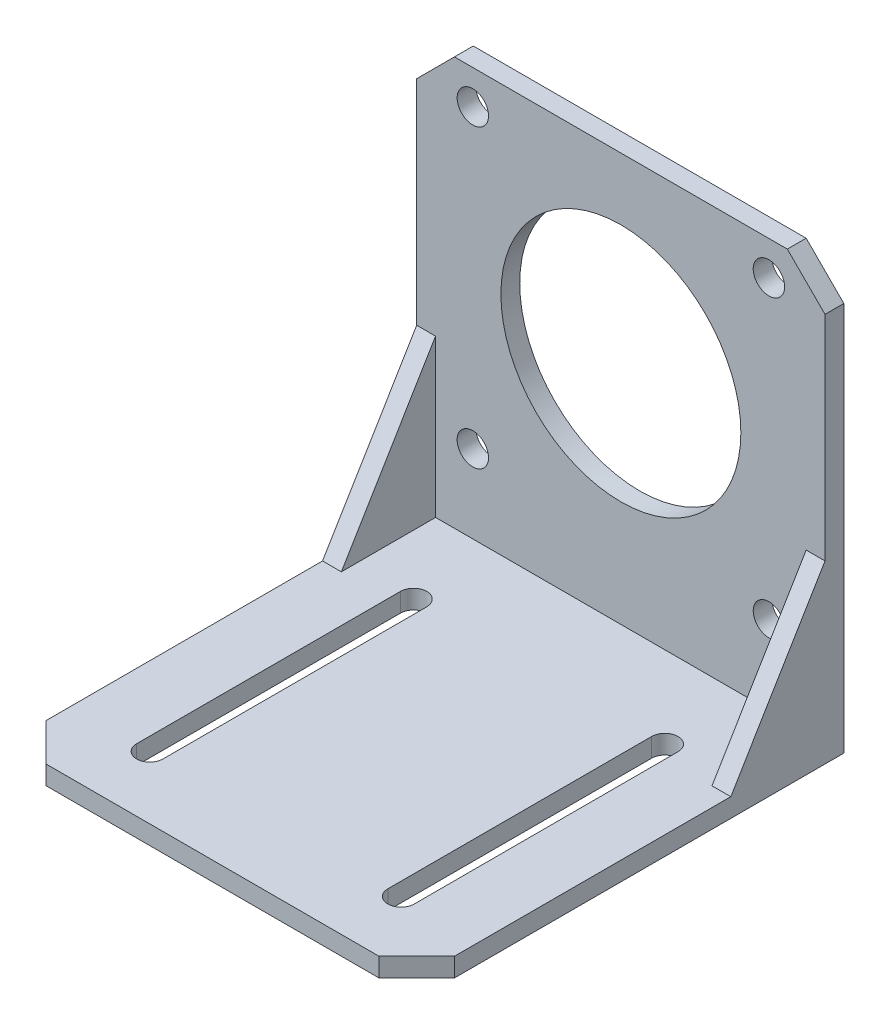
ISO-10303-21;
HEADER;
FILE_DESCRIPTION(('STEP AP214'),'2;1');
FILE_NAME('part.step','',(''),(''),'','','');
FILE_SCHEMA(('AUTOMOTIVE_DESIGN { 1 0 10303 214 1 1 1 1 }'));
ENDSEC;
DATA;
#1=APPLICATION_CONTEXT('core data for automotive mechanical design processes');
#2=APPLICATION_PROTOCOL_DEFINITION('international standard','automotive_design',2000,#1);
#3=PRODUCT_CONTEXT('',#1,'mechanical');
#4=PRODUCT('Part','Part','',(#3));
#5=PRODUCT_RELATED_PRODUCT_CATEGORY('part','',(#4));
#6=PRODUCT_DEFINITION_FORMATION('','',#4);
#7=PRODUCT_DEFINITION_CONTEXT('part definition',#1,'design');
#8=PRODUCT_DEFINITION('design','',#6,#7);
#9=PRODUCT_DEFINITION_SHAPE('','',#8);
#10=(LENGTH_UNIT() NAMED_UNIT(*) SI_UNIT(.MILLI.,.METRE.));
#11=(NAMED_UNIT(*) PLANE_ANGLE_UNIT() SI_UNIT($,.RADIAN.));
#12=(NAMED_UNIT(*) SI_UNIT($,.STERADIAN.) SOLID_ANGLE_UNIT());
#13=UNCERTAINTY_MEASURE_WITH_UNIT(LENGTH_MEASURE(1.E-05),#10,'distance_accuracy_value','');
#14=(GEOMETRIC_REPRESENTATION_CONTEXT(3) GLOBAL_UNCERTAINTY_ASSIGNED_CONTEXT((#13)) GLOBAL_UNIT_ASSIGNED_CONTEXT((#10,
#11,#12)) REPRESENTATION_CONTEXT('',''));
#15=CARTESIAN_POINT('',(0.,0.,0.));
#16=DIRECTION('',(0.,0.,1.));
#17=DIRECTION('',(1.,0.,0.));
#18=AXIS2_PLACEMENT_3D('',#15,#16,#17);
#19=CARTESIAN_POINT('',(0.,68.,0.));
#20=DIRECTION('',(0.,1.,0.));
#21=DIRECTION('',(0.,0.,1.));
#22=AXIS2_PLACEMENT_3D('',#19,#20,#21);
#23=PLANE('',#22);
#24=DIRECTION('',(0.,0.,1.));
#25=VECTOR('',#24,1.);
#26=CARTESIAN_POINT('',(6.,68.,-65.001));
#27=LINE('',#26,#25);
#28=CARTESIAN_POINT('',(6.,68.,-68.));
#29=VERTEX_POINT('',#28);
#30=CARTESIAN_POINT('',(6.,68.,-65.));
#31=VERTEX_POINT('',#30);
#32=EDGE_CURVE('E296',#29,#31,#27,.T.);
#33=ORIENTED_EDGE('',*,*,#32,.T.);
#34=DIRECTION('',(1.,0.,0.));
#35=VECTOR('',#34,1.);
#36=CARTESIAN_POINT('',(0.,68.,-65.));
#37=LINE('',#36,#35);
#38=CARTESIAN_POINT('',(59.,68.,-65.));
#39=VERTEX_POINT('',#38);
#40=EDGE_CURVE('E258',#31,#39,#37,.T.);
#41=ORIENTED_EDGE('',*,*,#40,.T.);
#42=DIRECTION('',(0.,0.,1.));
#43=VECTOR('',#42,1.);
#44=CARTESIAN_POINT('',(59.,68.,-65.001));
#45=LINE('',#44,#43);
#46=CARTESIAN_POINT('',(59.,68.,-68.));
#47=VERTEX_POINT('',#46);
#48=EDGE_CURVE('E294',#47,#39,#45,.T.);
#49=ORIENTED_EDGE('',*,*,#48,.F.);
#50=DIRECTION('',(1.,0.,0.));
#51=VECTOR('',#50,1.);
#52=CARTESIAN_POINT('',(59.,68.,-68.));
#53=LINE('',#52,#51);
#54=EDGE_CURVE('E288',#29,#47,#53,.T.);
#55=ORIENTED_EDGE('',*,*,#54,.F.);
#56=EDGE_LOOP('',(#33,#41,#49,#55));
#57=FACE_BOUND('',#56,.T.);
#58=ADVANCED_FACE('F35',(#57),#23,.T.);
#59=CARTESIAN_POINT('',(8.93,62.57,-65.001));
#60=DIRECTION('',(0.,0.,1.));
#61=DIRECTION('',(1.,0.,0.));
#62=AXIS2_PLACEMENT_3D('',#59,#60,#61);
#63=CYLINDRICAL_SURFACE('',#62,2.5);
#64=CARTESIAN_POINT('',(8.93,62.57,-68.));
#65=DIRECTION('',(0.,0.,-1.));
#66=DIRECTION('',(-1.,0.,0.));
#67=AXIS2_PLACEMENT_3D('',#64,#65,#66);
#68=CIRCLE('',#67,2.5);
#69=CARTESIAN_POINT('',(6.43,62.57,-68.));
#70=VERTEX_POINT('',#69);
#71=EDGE_CURVE('E267',#70,#70,#68,.T.);
#72=ORIENTED_EDGE('',*,*,#71,.T.);
#73=EDGE_LOOP('',(#72));
#74=FACE_BOUND('',#73,.T.);
#75=CARTESIAN_POINT('',(8.93,62.57,-65.));
#76=DIRECTION('',(0.,0.,1.));
#77=DIRECTION('',(1.,0.,0.));
#78=AXIS2_PLACEMENT_3D('',#75,#76,#77);
#79=CIRCLE('',#78,2.5);
#80=CARTESIAN_POINT('',(11.43,62.57,-65.));
#81=VERTEX_POINT('',#80);
#82=EDGE_CURVE('E264',#81,#81,#79,.F.);
#83=ORIENTED_EDGE('',*,*,#82,.F.);
#84=EDGE_LOOP('',(#83));
#85=FACE_BOUND('',#84,.T.);
#86=ADVANCED_FACE('F440',(#74,#85),#63,.F.);
#87=CARTESIAN_POINT('',(-31.,30.9999999999994,-65.001));
#88=DIRECTION('',(-0.707106781186554,0.707106781186542,0.));
#89=DIRECTION('',(-0.707106781186542,-0.707106781186554,0.));
#90=AXIS2_PLACEMENT_3D('',#87,#88,#89);
#91=PLANE('',#90);
#92=DIRECTION('',(0.,0.,1.));
#93=VECTOR('',#92,1.);
#94=CARTESIAN_POINT('',(0.,61.9999999999999,-65.001));
#95=LINE('',#94,#93);
#96=CARTESIAN_POINT('',(0.,61.9999999999999,-68.));
#97=VERTEX_POINT('',#96);
#98=CARTESIAN_POINT('',(0.,61.9999999999999,-65.));
#99=VERTEX_POINT('',#98);
#100=EDGE_CURVE('E299',#97,#99,#95,.T.);
#101=ORIENTED_EDGE('',*,*,#100,.T.);
#102=DIRECTION('',(0.707106781186542,0.707106781186554,0.));
#103=VECTOR('',#102,1.);
#104=CARTESIAN_POINT('',(-31.,30.9999999999994,-65.));
#105=LINE('',#104,#103);
#106=EDGE_CURVE('E261',#99,#31,#105,.T.);
#107=ORIENTED_EDGE('',*,*,#106,.T.);
#108=ORIENTED_EDGE('',*,*,#32,.F.);
#109=DIRECTION('',(0.707106781186542,0.707106781186553,0.));
#110=VECTOR('',#109,1.);
#111=CARTESIAN_POINT('',(6.,68.,-68.));
#112=LINE('',#111,#110);
#113=EDGE_CURVE('E285',#97,#29,#112,.T.);
#114=ORIENTED_EDGE('',*,*,#113,.F.);
#115=EDGE_LOOP('',(#101,#107,#108,#114));
#116=FACE_BOUND('',#115,.T.);
#117=ADVANCED_FACE('F446',(#116),#91,.T.);
#118=CARTESIAN_POINT('',(63.4999999999997,63.5000000000004,-65.001));
#119=DIRECTION('',(-0.707106781186544,-0.707106781186551,0.));
#120=DIRECTION('',(0.707106781186551,-0.707106781186544,0.));
#121=AXIS2_PLACEMENT_3D('',#118,#119,#120);
#122=PLANE('',#121);
#123=DIRECTION('',(-0.707106781186551,0.707106781186544,0.));
#124=VECTOR('',#123,1.);
#125=CARTESIAN_POINT('',(63.4999999999997,63.5000000000004,-65.));
#126=LINE('',#125,#124);
#127=CARTESIAN_POINT('',(65.,62.0000000000001,-65.));
#128=VERTEX_POINT('',#127);
#129=EDGE_CURVE('E256',#128,#39,#126,.T.);
#130=ORIENTED_EDGE('',*,*,#129,.F.);
#131=DIRECTION('',(0.,0.,1.));
#132=VECTOR('',#131,1.);
#133=CARTESIAN_POINT('',(65.,62.0000000000001,-65.001));
#134=LINE('',#133,#132);
#135=CARTESIAN_POINT('',(65.,62.0000000000001,-68.));
#136=VERTEX_POINT('',#135);
#137=EDGE_CURVE('E196',#136,#128,#134,.T.);
#138=ORIENTED_EDGE('',*,*,#137,.F.);
#139=DIRECTION('',(0.707106781186552,-0.707106781186544,0.));
#140=VECTOR('',#139,1.);
#141=CARTESIAN_POINT('',(65.,62.0000000000001,-68.));
#142=LINE('',#141,#140);
#143=EDGE_CURVE('E291',#47,#136,#142,.T.);
#144=ORIENTED_EDGE('',*,*,#143,.F.);
#145=ORIENTED_EDGE('',*,*,#48,.T.);
#146=EDGE_LOOP('',(#130,#138,#144,#145));
#147=FACE_BOUND('',#146,.T.);
#148=ADVANCED_FACE('F512',(#147),#122,.F.);
#149=CARTESIAN_POINT('',(32.5,39.,-65.001));
#150=DIRECTION('',(0.,0.,1.));
#151=DIRECTION('',(1.,0.,0.));
#152=AXIS2_PLACEMENT_3D('',#149,#150,#151);
#153=CYLINDRICAL_SURFACE('',#152,19.1);
#154=CARTESIAN_POINT('',(32.5,39.,-68.));
#155=DIRECTION('',(0.,0.,-1.));
#156=DIRECTION('',(-1.,0.,0.));
#157=AXIS2_PLACEMENT_3D('',#154,#155,#156);
#158=CIRCLE('',#157,19.1);
#159=CARTESIAN_POINT('',(13.4,39.,-68.));
#160=VERTEX_POINT('',#159);
#161=EDGE_CURVE('E273',#160,#160,#158,.T.);
#162=ORIENTED_EDGE('',*,*,#161,.T.);
#163=EDGE_LOOP('',(#162));
#164=FACE_BOUND('',#163,.T.);
#165=CARTESIAN_POINT('',(32.5,39.,-65.));
#166=DIRECTION('',(0.,0.,1.));
#167=DIRECTION('',(1.,0.,0.));
#168=AXIS2_PLACEMENT_3D('',#165,#166,#167);
#169=CIRCLE('',#168,19.1);
#170=CARTESIAN_POINT('',(51.6,39.,-65.));
#171=VERTEX_POINT('',#170);
#172=EDGE_CURVE('E253',#171,#171,#169,.F.);
#173=ORIENTED_EDGE('',*,*,#172,.F.);
#174=EDGE_LOOP('',(#173));
#175=FACE_BOUND('',#174,.T.);
#176=ADVANCED_FACE('F553',(#164,#175),#153,.F.);
#177=CARTESIAN_POINT('',(56.07,62.57,-65.001));
#178=DIRECTION('',(0.,0.,1.));
#179=DIRECTION('',(1.,0.,0.));
#180=AXIS2_PLACEMENT_3D('',#177,#178,#179);
#181=CYLINDRICAL_SURFACE('',#180,2.5);
#182=CARTESIAN_POINT('',(56.07,62.57,-68.));
#183=DIRECTION('',(0.,0.,-1.));
#184=DIRECTION('',(-1.,0.,0.));
#185=AXIS2_PLACEMENT_3D('',#182,#183,#184);
#186=CIRCLE('',#185,2.5);
#187=CARTESIAN_POINT('',(53.57,62.57,-68.));
#188=VERTEX_POINT('',#187);
#189=EDGE_CURVE('E270',#188,#188,#186,.T.);
#190=ORIENTED_EDGE('',*,*,#189,.T.);
#191=EDGE_LOOP('',(#190));
#192=FACE_BOUND('',#191,.T.);
#193=CARTESIAN_POINT('',(56.07,62.57,-65.));
#194=DIRECTION('',(0.,0.,1.));
#195=DIRECTION('',(1.,0.,0.));
#196=AXIS2_PLACEMENT_3D('',#193,#194,#195);
#197=CIRCLE('',#196,2.5);
#198=CARTESIAN_POINT('',(58.57,62.57,-65.));
#199=VERTEX_POINT('',#198);
#200=EDGE_CURVE('E199',#199,#199,#197,.F.);
#201=ORIENTED_EDGE('',*,*,#200,.F.);
#202=EDGE_LOOP('',(#201));
#203=FACE_BOUND('',#202,.T.);
#204=ADVANCED_FACE('F458',(#192,#203),#181,.F.);
#205=CARTESIAN_POINT('',(0.,3.,0.));
#206=DIRECTION('',(-1.,0.,0.));
#207=DIRECTION('',(0.,0.,1.));
#208=AXIS2_PLACEMENT_3D('',#205,#206,#207);
#209=PLANE('',#208);
#210=DIRECTION('',(0.,0.,-1.));
#211=VECTOR('',#210,1.);
#212=CARTESIAN_POINT('',(0.,3.,0.));
#213=LINE('',#212,#211);
#214=CARTESIAN_POINT('',(0.,3.,-6.));
#215=VERTEX_POINT('',#214);
#216=CARTESIAN_POINT('',(0.,3.,-50.));
#217=VERTEX_POINT('',#216);
#218=EDGE_CURVE('E39',#215,#217,#213,.T.);
#219=ORIENTED_EDGE('',*,*,#218,.T.);
#220=DIRECTION('',(0.,0.857492925712544,-0.514495755427526));
#221=VECTOR('',#220,1.);
#222=CARTESIAN_POINT('',(0.,28.,-65.));
#223=LINE('',#222,#221);
#224=CARTESIAN_POINT('',(0.,28.,-65.));
#225=VERTEX_POINT('',#224);
#226=EDGE_CURVE('E220',#217,#225,#223,.T.);
#227=ORIENTED_EDGE('',*,*,#226,.T.);
#228=DIRECTION('',(0.,-1.,0.));
#229=VECTOR('',#228,1.);
#230=CARTESIAN_POINT('',(0.,69.4838739724372,-65.));
#231=LINE('',#230,#229);
#232=EDGE_CURVE('E246',#99,#225,#231,.T.);
#233=ORIENTED_EDGE('',*,*,#232,.F.);
#234=ORIENTED_EDGE('',*,*,#100,.F.);
#235=DIRECTION('',(0.,1.,0.));
#236=VECTOR('',#235,1.);
#237=CARTESIAN_POINT('',(0.,61.9999999999999,-68.));
#238=LINE('',#237,#236);
#239=CARTESIAN_POINT('',(0.,0.,-68.));
#240=VERTEX_POINT('',#239);
#241=EDGE_CURVE('E282',#240,#97,#238,.T.);
#242=ORIENTED_EDGE('',*,*,#241,.F.);
#243=DIRECTION('',(0.,0.,-1.));
#244=VECTOR('',#243,1.);
#245=CARTESIAN_POINT('',(0.,0.,0.));
#246=LINE('',#245,#244);
#247=CARTESIAN_POINT('',(0.,0.,-6.));
#248=VERTEX_POINT('',#247);
#249=EDGE_CURVE('E308',#248,#240,#246,.T.);
#250=ORIENTED_EDGE('',*,*,#249,.F.);
#251=DIRECTION('',(0.,-1.,0.));
#252=VECTOR('',#251,1.);
#253=CARTESIAN_POINT('',(0.,3.,-6.));
#254=LINE('',#253,#252);
#255=EDGE_CURVE('E355',#215,#248,#254,.T.);
#256=ORIENTED_EDGE('',*,*,#255,.F.);
#257=EDGE_LOOP('',(#219,#227,#233,#234,#242,#250,#256));
#258=FACE_BOUND('',#257,.T.);
#259=ADVANCED_FACE('F454',(#258),#209,.T.);
#260=CARTESIAN_POINT('',(3.,3.,-3.00000000000005));
#261=DIRECTION('',(0.707106781186541,0.,-0.707106781186554));
#262=DIRECTION('',(-0.707106781186554,0.,-0.707106781186541));
#263=AXIS2_PLACEMENT_3D('',#260,#261,#262);
#264=PLANE('',#263);
#265=DIRECTION('',(0.707106781186554,0.,0.707106781186541));
#266=VECTOR('',#265,1.);
#267=CARTESIAN_POINT('',(3.,0.,-3.00000000000005));
#268=LINE('',#267,#266);
#269=CARTESIAN_POINT('',(6.0000000000001,0.,0.));
#270=VERTEX_POINT('',#269);
#271=EDGE_CURVE('E374',#248,#270,#268,.T.);
#272=ORIENTED_EDGE('',*,*,#271,.T.);
#273=DIRECTION('',(0.,-1.,0.));
#274=VECTOR('',#273,1.);
#275=CARTESIAN_POINT('',(6.0000000000001,3.,0.));
#276=LINE('',#275,#274);
#277=CARTESIAN_POINT('',(6.0000000000001,3.,0.));
#278=VERTEX_POINT('',#277);
#279=EDGE_CURVE('E11',#278,#270,#276,.T.);
#280=ORIENTED_EDGE('',*,*,#279,.F.);
#281=DIRECTION('',(0.707106781186554,0.,0.707106781186541));
#282=VECTOR('',#281,1.);
#283=CARTESIAN_POINT('',(3.,3.,-3.00000000000005));
#284=LINE('',#283,#282);
#285=EDGE_CURVE('E330',#215,#278,#284,.T.);
#286=ORIENTED_EDGE('',*,*,#285,.F.);
#287=ORIENTED_EDGE('',*,*,#255,.T.);
#288=EDGE_LOOP('',(#272,#280,#286,#287));
#289=FACE_BOUND('',#288,.T.);
#290=ADVANCED_FACE('F457',(#289),#264,.F.);
#291=CARTESIAN_POINT('',(0.,3.,0.));
#292=DIRECTION('',(0.,0.,1.));
#293=DIRECTION('',(1.,0.,0.));
#294=AXIS2_PLACEMENT_3D('',#291,#292,#293);
#295=PLANE('',#294);
#296=DIRECTION('',(-1.,0.,0.));
#297=VECTOR('',#296,1.);
#298=CARTESIAN_POINT('',(0.,0.,0.));
#299=LINE('',#298,#297);
#300=CARTESIAN_POINT('',(59.,0.,0.));
#301=VERTEX_POINT('',#300);
#302=EDGE_CURVE('E371',#301,#270,#299,.T.);
#303=ORIENTED_EDGE('',*,*,#302,.F.);
#304=DIRECTION('',(0.,-1.,0.));
#305=VECTOR('',#304,1.);
#306=CARTESIAN_POINT('',(59.,3.,0.));
#307=LINE('',#306,#305);
#308=CARTESIAN_POINT('',(59.,3.,0.));
#309=VERTEX_POINT('',#308);
#310=EDGE_CURVE('E45',#309,#301,#307,.T.);
#311=ORIENTED_EDGE('',*,*,#310,.F.);
#312=DIRECTION('',(-1.,0.,0.));
#313=VECTOR('',#312,1.);
#314=CARTESIAN_POINT('',(0.,3.,0.));
#315=LINE('',#314,#313);
#316=EDGE_CURVE('E332',#309,#278,#315,.T.);
#317=ORIENTED_EDGE('',*,*,#316,.T.);
#318=ORIENTED_EDGE('',*,*,#279,.T.);
#319=EDGE_LOOP('',(#303,#311,#317,#318));
#320=FACE_BOUND('',#319,.T.);
#321=ADVANCED_FACE('F466',(#320),#295,.T.);
#322=CARTESIAN_POINT('',(29.5000000000005,3.,29.5));
#323=DIRECTION('',(-0.707106781186554,0.,-0.707106781186541));
#324=DIRECTION('',(-0.707106781186541,0.,0.707106781186554));
#325=AXIS2_PLACEMENT_3D('',#322,#323,#324);
#326=PLANE('',#325);
#327=DIRECTION('',(0.707106781186542,0.,-0.707106781186554));
#328=VECTOR('',#327,1.);
#329=CARTESIAN_POINT('',(29.5000000000005,0.,29.5));
#330=LINE('',#329,#328);
#331=CARTESIAN_POINT('',(65.,0.,-6.00000000000011));
#332=VERTEX_POINT('',#331);
#333=EDGE_CURVE('E369',#301,#332,#330,.T.);
#334=ORIENTED_EDGE('',*,*,#333,.T.);
#335=DIRECTION('',(0.,-1.,0.));
#336=VECTOR('',#335,1.);
#337=CARTESIAN_POINT('',(65.,3.,-6.00000000000011));
#338=LINE('',#337,#336);
#339=CARTESIAN_POINT('',(65.,3.,-6.00000000000011));
#340=VERTEX_POINT('',#339);
#341=EDGE_CURVE('E362',#340,#332,#338,.T.);
#342=ORIENTED_EDGE('',*,*,#341,.F.);
#343=DIRECTION('',(0.707106781186542,0.,-0.707106781186554));
#344=VECTOR('',#343,1.);
#345=CARTESIAN_POINT('',(29.5000000000005,3.,29.5));
#346=LINE('',#345,#344);
#347=EDGE_CURVE('E335',#309,#340,#346,.T.);
#348=ORIENTED_EDGE('',*,*,#347,.F.);
#349=ORIENTED_EDGE('',*,*,#310,.T.);
#350=EDGE_LOOP('',(#334,#342,#348,#349));
#351=FACE_BOUND('',#350,.T.);
#352=ADVANCED_FACE('F463',(#351),#326,.F.);
#353=CARTESIAN_POINT('',(65.,3.,0.));
#354=DIRECTION('',(-1.,0.,0.));
#355=DIRECTION('',(0.,0.,1.));
#356=AXIS2_PLACEMENT_3D('',#353,#354,#355);
#357=PLANE('',#356);
#358=DIRECTION('',(0.,1.,0.));
#359=VECTOR('',#358,1.);
#360=CARTESIAN_POINT('',(65.,69.4838739724372,-65.));
#361=LINE('',#360,#359);
#362=CARTESIAN_POINT('',(65.,28.,-65.));
#363=VERTEX_POINT('',#362);
#364=EDGE_CURVE('E190',#363,#128,#361,.T.);
#365=ORIENTED_EDGE('',*,*,#364,.F.);
#366=DIRECTION('',(0.,-0.857492925712544,0.514495755427526));
#367=VECTOR('',#366,1.);
#368=CARTESIAN_POINT('',(65.,3.,-50.));
#369=LINE('',#368,#367);
#370=CARTESIAN_POINT('',(65.,3.,-50.));
#371=VERTEX_POINT('',#370);
#372=EDGE_CURVE('E194',#363,#371,#369,.T.);
#373=ORIENTED_EDGE('',*,*,#372,.T.);
#374=DIRECTION('',(0.,0.,-1.));
#375=VECTOR('',#374,1.);
#376=CARTESIAN_POINT('',(65.,3.,0.));
#377=LINE('',#376,#375);
#378=EDGE_CURVE('E58',#340,#371,#377,.T.);
#379=ORIENTED_EDGE('',*,*,#378,.F.);
#380=ORIENTED_EDGE('',*,*,#341,.T.);
#381=DIRECTION('',(0.,0.,-1.));
#382=VECTOR('',#381,1.);
#383=CARTESIAN_POINT('',(65.,0.,0.));
#384=LINE('',#383,#382);
#385=CARTESIAN_POINT('',(65.,0.,-68.));
#386=VERTEX_POINT('',#385);
#387=EDGE_CURVE('E367',#332,#386,#384,.T.);
#388=ORIENTED_EDGE('',*,*,#387,.T.);
#389=DIRECTION('',(0.,-1.,0.));
#390=VECTOR('',#389,1.);
#391=CARTESIAN_POINT('',(65.,0.,-68.));
#392=LINE('',#391,#390);
#393=EDGE_CURVE('E276',#136,#386,#392,.T.);
#394=ORIENTED_EDGE('',*,*,#393,.F.);
#395=ORIENTED_EDGE('',*,*,#137,.T.);
#396=EDGE_LOOP('',(#365,#373,#379,#380,#388,#394,#395));
#397=FACE_BOUND('',#396,.T.);
#398=ADVANCED_FACE('F192',(#397),#357,.F.);
#399=CARTESIAN_POINT('',(52.5,3.,-10.));
#400=DIRECTION('',(0.,-1.,0.));
#401=DIRECTION('',(0.,0.,-1.));
#402=AXIS2_PLACEMENT_3D('',#399,#400,#401);
#403=CYLINDRICAL_SURFACE('',#402,2.1);
#404=CARTESIAN_POINT('',(52.5,0.,-10.));
#405=DIRECTION('',(0.,1.,0.));
#406=DIRECTION('',(0.,0.,1.));
#407=AXIS2_PLACEMENT_3D('',#404,#405,#406);
#408=CIRCLE('',#407,2.1);
#409=CARTESIAN_POINT('',(50.4,0.,-10.));
#410=VERTEX_POINT('',#409);
#411=CARTESIAN_POINT('',(54.6,0.,-10.));
#412=VERTEX_POINT('',#411);
#413=EDGE_CURVE('E386',#410,#412,#408,.T.);
#414=ORIENTED_EDGE('',*,*,#413,.F.);
#415=DIRECTION('',(0.,-1.,0.));
#416=VECTOR('',#415,1.);
#417=CARTESIAN_POINT('',(50.4,3.,-10.));
#418=LINE('',#417,#416);
#419=CARTESIAN_POINT('',(50.4,3.,-10.));
#420=VERTEX_POINT('',#419);
#421=EDGE_CURVE('E353',#420,#410,#418,.T.);
#422=ORIENTED_EDGE('',*,*,#421,.F.);
#423=CARTESIAN_POINT('',(52.5,3.,-10.));
#424=DIRECTION('',(0.,1.,0.));
#425=DIRECTION('',(0.,0.,1.));
#426=AXIS2_PLACEMENT_3D('',#423,#424,#425);
#427=CIRCLE('',#426,2.1);
#428=CARTESIAN_POINT('',(54.6,3.,-10.));
#429=VERTEX_POINT('',#428);
#430=EDGE_CURVE('E319',#420,#429,#427,.T.);
#431=ORIENTED_EDGE('',*,*,#430,.T.);
#432=DIRECTION('',(0.,-1.,0.));
#433=VECTOR('',#432,1.);
#434=CARTESIAN_POINT('',(54.6,3.,-10.));
#435=LINE('',#434,#433);
#436=EDGE_CURVE('E343',#429,#412,#435,.T.);
#437=ORIENTED_EDGE('',*,*,#436,.T.);
#438=EDGE_LOOP('',(#414,#422,#431,#437));
#439=FACE_BOUND('',#438,.T.);
#440=ADVANCED_FACE('F462',(#439),#403,.F.);
#441=CARTESIAN_POINT('',(50.4,3.,0.));
#442=DIRECTION('',(1.,0.,0.));
#443=DIRECTION('',(0.,0.,-1.));
#444=AXIS2_PLACEMENT_3D('',#441,#442,#443);
#445=PLANE('',#444);
#446=DIRECTION('',(0.,0.,1.));
#447=VECTOR('',#446,1.);
#448=CARTESIAN_POINT('',(50.4,0.,0.));
#449=LINE('',#448,#447);
#450=CARTESIAN_POINT('',(50.4,0.,-52.));
#451=VERTEX_POINT('',#450);
#452=EDGE_CURVE('E383',#451,#410,#449,.T.);
#453=ORIENTED_EDGE('',*,*,#452,.F.);
#454=DIRECTION('',(0.,-1.,0.));
#455=VECTOR('',#454,1.);
#456=CARTESIAN_POINT('',(50.4,3.,-52.));
#457=LINE('',#456,#455);
#458=CARTESIAN_POINT('',(50.4,3.,-52.));
#459=VERTEX_POINT('',#458);
#460=EDGE_CURVE('E356',#459,#451,#457,.T.);
#461=ORIENTED_EDGE('',*,*,#460,.F.);
#462=DIRECTION('',(0.,0.,1.));
#463=VECTOR('',#462,1.);
#464=CARTESIAN_POINT('',(50.4,3.,0.));
#465=LINE('',#464,#463);
#466=EDGE_CURVE('E322',#459,#420,#465,.T.);
#467=ORIENTED_EDGE('',*,*,#466,.T.);
#468=ORIENTED_EDGE('',*,*,#421,.T.);
#469=EDGE_LOOP('',(#453,#461,#467,#468));
#470=FACE_BOUND('',#469,.T.);
#471=ADVANCED_FACE('F477',(#470),#445,.T.);
#472=CARTESIAN_POINT('',(52.5,3.,-52.));
#473=DIRECTION('',(0.,-1.,0.));
#474=DIRECTION('',(0.,0.,-1.));
#475=AXIS2_PLACEMENT_3D('',#472,#473,#474);
#476=CYLINDRICAL_SURFACE('',#475,2.1);
#477=CARTESIAN_POINT('',(52.5,0.,-52.));
#478=DIRECTION('',(0.,1.,0.));
#479=DIRECTION('',(0.,0.,1.));
#480=AXIS2_PLACEMENT_3D('',#477,#478,#479);
#481=CIRCLE('',#480,2.1);
#482=CARTESIAN_POINT('',(54.6,0.,-52.));
#483=VERTEX_POINT('',#482);
#484=EDGE_CURVE('E380',#483,#451,#481,.T.);
#485=ORIENTED_EDGE('',*,*,#484,.F.);
#486=DIRECTION('',(0.,-1.,0.));
#487=VECTOR('',#486,1.);
#488=CARTESIAN_POINT('',(54.6,3.,-52.));
#489=LINE('',#488,#487);
#490=CARTESIAN_POINT('',(54.6,3.,-52.));
#491=VERTEX_POINT('',#490);
#492=EDGE_CURVE('E358',#491,#483,#489,.T.);
#493=ORIENTED_EDGE('',*,*,#492,.F.);
#494=CARTESIAN_POINT('',(52.5,3.,-52.));
#495=DIRECTION('',(0.,1.,0.));
#496=DIRECTION('',(0.,0.,1.));
#497=AXIS2_PLACEMENT_3D('',#494,#495,#496);
#498=CIRCLE('',#497,2.1);
#499=EDGE_CURVE('E325',#491,#459,#498,.T.);
#500=ORIENTED_EDGE('',*,*,#499,.T.);
#501=ORIENTED_EDGE('',*,*,#460,.T.);
#502=EDGE_LOOP('',(#485,#493,#500,#501));
#503=FACE_BOUND('',#502,.T.);
#504=ADVANCED_FACE('F474',(#503),#476,.F.);
#505=CARTESIAN_POINT('',(14.594267284713,3.,0.00835948980955808));
#506=DIRECTION('',(0.9999998359543,0.,0.00057279260925802));
#507=DIRECTION('',(0.00057279260925802,0.,-0.9999998359543));
#508=AXIS2_PLACEMENT_3D('',#505,#506,#507);
#509=PLANE('',#508);
#510=DIRECTION('',(-0.00057279260925802,0.,0.9999998359543));
#511=VECTOR('',#510,1.);
#512=CARTESIAN_POINT('',(14.594267284713,0.,0.00835948980955808));
#513=LINE('',#512,#511);
#514=CARTESIAN_POINT('',(14.6240572935353,0.,-52.));
#515=VERTEX_POINT('',#514);
#516=CARTESIAN_POINT('',(14.6,0.,-9.99999999999999));
#517=VERTEX_POINT('',#516);
#518=EDGE_CURVE('E302',#515,#517,#513,.T.);
#519=ORIENTED_EDGE('',*,*,#518,.T.);
#520=DIRECTION('',(0.,-1.,0.));
#521=VECTOR('',#520,1.);
#522=CARTESIAN_POINT('',(14.6,3.,-9.99999999999999));
#523=LINE('',#522,#521);
#524=CARTESIAN_POINT('',(14.6,3.,-9.99999999999999));
#525=VERTEX_POINT('',#524);
#526=EDGE_CURVE('E341',#525,#517,#523,.T.);
#527=ORIENTED_EDGE('',*,*,#526,.F.);
#528=DIRECTION('',(-0.00057279260925802,0.,0.9999998359543));
#529=VECTOR('',#528,1.);
#530=CARTESIAN_POINT('',(14.594267284713,3.,0.00835948980955808));
#531=LINE('',#530,#529);
#532=CARTESIAN_POINT('',(14.6240572935353,3.,-52.));
#533=VERTEX_POINT('',#532);
#534=EDGE_CURVE('E305',#533,#525,#531,.T.);
#535=ORIENTED_EDGE('',*,*,#534,.F.);
#536=DIRECTION('',(0.,-1.,0.));
#537=VECTOR('',#536,1.);
#538=CARTESIAN_POINT('',(14.6240572935353,3.,-52.));
#539=LINE('',#538,#537);
#540=EDGE_CURVE('E350',#533,#515,#539,.T.);
#541=ORIENTED_EDGE('',*,*,#540,.T.);
#542=EDGE_LOOP('',(#519,#527,#535,#541));
#543=FACE_BOUND('',#542,.T.);
#544=ADVANCED_FACE('F37',(#543),#509,.F.);
#545=CARTESIAN_POINT('',(12.5,3.,-9.99999999999999));
#546=DIRECTION('',(0.,-1.,0.));
#547=DIRECTION('',(0.,0.,-1.));
#548=AXIS2_PLACEMENT_3D('',#545,#546,#547);
#549=CYLINDRICAL_SURFACE('',#548,2.1);
#550=CARTESIAN_POINT('',(12.5,0.,-9.99999999999999));
#551=DIRECTION('',(0.,1.,0.));
#552=DIRECTION('',(0.,0.,1.));
#553=AXIS2_PLACEMENT_3D('',#550,#551,#552);
#554=CIRCLE('',#553,2.1);
#555=CARTESIAN_POINT('',(10.4,0.,-9.99999999999999));
#556=VERTEX_POINT('',#555);
#557=EDGE_CURVE('E397',#556,#517,#554,.T.);
#558=ORIENTED_EDGE('',*,*,#557,.F.);
#559=DIRECTION('',(0.,-1.,0.));
#560=VECTOR('',#559,1.);
#561=CARTESIAN_POINT('',(10.4,3.,-9.99999999999999));
#562=LINE('',#561,#560);
#563=CARTESIAN_POINT('',(10.4,3.,-9.99999999999999));
#564=VERTEX_POINT('',#563);
#565=EDGE_CURVE('E344',#564,#556,#562,.T.);
#566=ORIENTED_EDGE('',*,*,#565,.F.);
#567=CARTESIAN_POINT('',(12.5,3.,-9.99999999999999));
#568=DIRECTION('',(0.,1.,0.));
#569=DIRECTION('',(0.,0.,1.));
#570=AXIS2_PLACEMENT_3D('',#567,#568,#569);
#571=CIRCLE('',#570,2.1);
#572=EDGE_CURVE('E307',#564,#525,#571,.T.);
#573=ORIENTED_EDGE('',*,*,#572,.T.);
#574=ORIENTED_EDGE('',*,*,#526,.T.);
#575=EDGE_LOOP('',(#558,#566,#573,#574));
#576=FACE_BOUND('',#575,.T.);
#577=ADVANCED_FACE('F412',(#576),#549,.F.);
#578=CARTESIAN_POINT('',(10.4,3.,0.));
#579=DIRECTION('',(1.,0.,0.));
#580=DIRECTION('',(0.,0.,-1.));
#581=AXIS2_PLACEMENT_3D('',#578,#579,#580);
#582=PLANE('',#581);
#583=DIRECTION('',(0.,0.,1.));
#584=VECTOR('',#583,1.);
#585=CARTESIAN_POINT('',(10.4,0.,0.));
#586=LINE('',#585,#584);
#587=CARTESIAN_POINT('',(10.4,0.,-52.));
#588=VERTEX_POINT('',#587);
#589=EDGE_CURVE('E394',#588,#556,#586,.T.);
#590=ORIENTED_EDGE('',*,*,#589,.F.);
#591=DIRECTION('',(0.,-1.,0.));
#592=VECTOR('',#591,1.);
#593=CARTESIAN_POINT('',(10.4,3.,-52.));
#594=LINE('',#593,#592);
#595=CARTESIAN_POINT('',(10.4,3.,-52.));
#596=VERTEX_POINT('',#595);
#597=EDGE_CURVE('E346',#596,#588,#594,.T.);
#598=ORIENTED_EDGE('',*,*,#597,.F.);
#599=DIRECTION('',(0.,0.,1.));
#600=VECTOR('',#599,1.);
#601=CARTESIAN_POINT('',(10.4,3.,0.));
#602=LINE('',#601,#600);
#603=EDGE_CURVE('E311',#596,#564,#602,.T.);
#604=ORIENTED_EDGE('',*,*,#603,.T.);
#605=ORIENTED_EDGE('',*,*,#565,.T.);
#606=EDGE_LOOP('',(#590,#598,#604,#605));
#607=FACE_BOUND('',#606,.T.);
#608=ADVANCED_FACE('F420',(#607),#582,.T.);
#609=CARTESIAN_POINT('',(12.5,3.,-52.));
#610=DIRECTION('',(0.,-1.,0.));
#611=DIRECTION('',(0.,0.,-1.));
#612=AXIS2_PLACEMENT_3D('',#609,#610,#611);
#613=CYLINDRICAL_SURFACE('',#612,2.1);
#614=CARTESIAN_POINT('',(12.5,0.,-52.));
#615=DIRECTION('',(0.,1.,0.));
#616=DIRECTION('',(0.,0.,1.));
#617=AXIS2_PLACEMENT_3D('',#614,#615,#616);
#618=CIRCLE('',#617,2.1);
#619=CARTESIAN_POINT('',(14.6,0.,-52.));
#620=VERTEX_POINT('',#619);
#621=EDGE_CURVE('E391',#620,#588,#618,.T.);
#622=ORIENTED_EDGE('',*,*,#621,.F.);
#623=DIRECTION('',(0.,-1.,0.));
#624=VECTOR('',#623,1.);
#625=CARTESIAN_POINT('',(14.6,3.,-52.));
#626=LINE('',#625,#624);
#627=CARTESIAN_POINT('',(14.6,3.,-52.));
#628=VERTEX_POINT('',#627);
#629=EDGE_CURVE('E348',#628,#620,#626,.T.);
#630=ORIENTED_EDGE('',*,*,#629,.F.);
#631=CARTESIAN_POINT('',(12.5,3.,-52.));
#632=DIRECTION('',(0.,1.,0.));
#633=DIRECTION('',(0.,0.,1.));
#634=AXIS2_PLACEMENT_3D('',#631,#632,#633);
#635=CIRCLE('',#634,2.1);
#636=EDGE_CURVE('E314',#628,#596,#635,.T.);
#637=ORIENTED_EDGE('',*,*,#636,.T.);
#638=ORIENTED_EDGE('',*,*,#597,.T.);
#639=EDGE_LOOP('',(#622,#630,#637,#638));
#640=FACE_BOUND('',#639,.T.);
#641=ADVANCED_FACE('F423',(#640),#613,.F.);
#642=CARTESIAN_POINT('',(54.6,3.,0.));
#643=DIRECTION('',(1.,0.,0.));
#644=DIRECTION('',(0.,0.,-1.));
#645=AXIS2_PLACEMENT_3D('',#642,#643,#644);
#646=PLANE('',#645);
#647=DIRECTION('',(0.,0.,1.));
#648=VECTOR('',#647,1.);
#649=CARTESIAN_POINT('',(54.6,0.,0.));
#650=LINE('',#649,#648);
#651=EDGE_CURVE('E377',#483,#412,#650,.T.);
#652=ORIENTED_EDGE('',*,*,#651,.T.);
#653=ORIENTED_EDGE('',*,*,#436,.F.);
#654=DIRECTION('',(0.,0.,1.));
#655=VECTOR('',#654,1.);
#656=CARTESIAN_POINT('',(54.6,3.,0.));
#657=LINE('',#656,#655);
#658=EDGE_CURVE('E328',#491,#429,#657,.T.);
#659=ORIENTED_EDGE('',*,*,#658,.F.);
#660=ORIENTED_EDGE('',*,*,#492,.T.);
#661=EDGE_LOOP('',(#652,#653,#659,#660));
#662=FACE_BOUND('',#661,.T.);
#663=ADVANCED_FACE('F428',(#662),#646,.F.);
#664=CARTESIAN_POINT('',(0.,3.,-52.));
#665=DIRECTION('',(0.,0.,-1.));
#666=DIRECTION('',(-1.,0.,0.));
#667=AXIS2_PLACEMENT_3D('',#664,#665,#666);
#668=PLANE('',#667);
#669=DIRECTION('',(1.,0.,0.));
#670=VECTOR('',#669,1.);
#671=CARTESIAN_POINT('',(0.,0.,-52.));
#672=LINE('',#671,#670);
#673=EDGE_CURVE('E389',#620,#515,#672,.T.);
#674=ORIENTED_EDGE('',*,*,#673,.T.);
#675=ORIENTED_EDGE('',*,*,#540,.F.);
#676=DIRECTION('',(1.,0.,0.));
#677=VECTOR('',#676,1.);
#678=CARTESIAN_POINT('',(0.,3.,-52.));
#679=LINE('',#678,#677);
#680=EDGE_CURVE('E317',#628,#533,#679,.T.);
#681=ORIENTED_EDGE('',*,*,#680,.F.);
#682=ORIENTED_EDGE('',*,*,#629,.T.);
#683=EDGE_LOOP('',(#674,#675,#681,#682));
#684=FACE_BOUND('',#683,.T.);
#685=ADVANCED_FACE('F426',(#684),#668,.F.);
#686=CARTESIAN_POINT('',(0.,3.,0.));
#687=DIRECTION('',(0.,1.,0.));
#688=DIRECTION('',(0.,0.,1.));
#689=AXIS2_PLACEMENT_3D('',#686,#687,#688);
#690=PLANE('',#689);
#691=DIRECTION('',(1.,0.,0.));
#692=VECTOR('',#691,1.);
#693=CARTESIAN_POINT('',(62.,3.,-50.));
#694=LINE('',#693,#692);
#695=CARTESIAN_POINT('',(62.,3.,-50.));
#696=VERTEX_POINT('',#695);
#697=EDGE_CURVE('E53',#696,#371,#694,.T.);
#698=ORIENTED_EDGE('',*,*,#697,.F.);
#699=DIRECTION('',(0.,0.,-1.));
#700=VECTOR('',#699,1.);
#701=CARTESIAN_POINT('',(62.,3.,-65.));
#702=LINE('',#701,#700);
#703=CARTESIAN_POINT('',(62.,3.,-65.));
#704=VERTEX_POINT('',#703);
#705=EDGE_CURVE('E211',#696,#704,#702,.T.);
#706=ORIENTED_EDGE('',*,*,#705,.T.);
#707=DIRECTION('',(1.,0.,0.));
#708=VECTOR('',#707,1.);
#709=CARTESIAN_POINT('',(0.,3.,-65.));
#710=LINE('',#709,#708);
#711=CARTESIAN_POINT('',(3.,3.,-65.));
#712=VERTEX_POINT('',#711);
#713=EDGE_CURVE('E200',#712,#704,#710,.T.);
#714=ORIENTED_EDGE('',*,*,#713,.F.);
#715=DIRECTION('',(0.,0.,1.));
#716=VECTOR('',#715,1.);
#717=CARTESIAN_POINT('',(3.,3.,-65.));
#718=LINE('',#717,#716);
#719=CARTESIAN_POINT('',(3.,3.,-50.));
#720=VERTEX_POINT('',#719);
#721=EDGE_CURVE('E224',#712,#720,#718,.T.);
#722=ORIENTED_EDGE('',*,*,#721,.T.);
#723=DIRECTION('',(-1.,0.,0.));
#724=VECTOR('',#723,1.);
#725=CARTESIAN_POINT('',(3.,3.,-50.));
#726=LINE('',#725,#724);
#727=EDGE_CURVE('E229',#720,#217,#726,.T.);
#728=ORIENTED_EDGE('',*,*,#727,.T.);
#729=ORIENTED_EDGE('',*,*,#218,.F.);
#730=ORIENTED_EDGE('',*,*,#285,.T.);
#731=ORIENTED_EDGE('',*,*,#316,.F.);
#732=ORIENTED_EDGE('',*,*,#347,.T.);
#733=ORIENTED_EDGE('',*,*,#378,.T.);
#734=EDGE_LOOP('',(#698,#706,#714,#722,#728,#729,#730,#731,#732,#733));
#735=FACE_BOUND('',#734,.T.);
#736=ORIENTED_EDGE('',*,*,#534,.T.);
#737=ORIENTED_EDGE('',*,*,#572,.F.);
#738=ORIENTED_EDGE('',*,*,#603,.F.);
#739=ORIENTED_EDGE('',*,*,#636,.F.);
#740=ORIENTED_EDGE('',*,*,#680,.T.);
#741=EDGE_LOOP('',(#736,#737,#738,#739,#740));
#742=FACE_BOUND('',#741,.T.);
#743=ORIENTED_EDGE('',*,*,#430,.F.);
#744=ORIENTED_EDGE('',*,*,#466,.F.);
#745=ORIENTED_EDGE('',*,*,#499,.F.);
#746=ORIENTED_EDGE('',*,*,#658,.T.);
#747=EDGE_LOOP('',(#743,#744,#745,#746));
#748=FACE_BOUND('',#747,.T.);
#749=ADVANCED_FACE('F416',(#735,#742,#748),#690,.T.);
#750=CARTESIAN_POINT('',(0.,0.,0.));
#751=DIRECTION('',(0.,1.,0.));
#752=DIRECTION('',(0.,0.,1.));
#753=AXIS2_PLACEMENT_3D('',#750,#751,#752);
#754=PLANE('',#753);
#755=ORIENTED_EDGE('',*,*,#518,.F.);
#756=ORIENTED_EDGE('',*,*,#673,.F.);
#757=ORIENTED_EDGE('',*,*,#621,.T.);
#758=ORIENTED_EDGE('',*,*,#589,.T.);
#759=ORIENTED_EDGE('',*,*,#557,.T.);
#760=EDGE_LOOP('',(#755,#756,#757,#758,#759));
#761=FACE_BOUND('',#760,.T.);
#762=ORIENTED_EDGE('',*,*,#413,.T.);
#763=ORIENTED_EDGE('',*,*,#651,.F.);
#764=ORIENTED_EDGE('',*,*,#484,.T.);
#765=ORIENTED_EDGE('',*,*,#452,.T.);
#766=EDGE_LOOP('',(#762,#763,#764,#765));
#767=FACE_BOUND('',#766,.T.);
#768=ORIENTED_EDGE('',*,*,#271,.F.);
#769=ORIENTED_EDGE('',*,*,#249,.T.);
#770=DIRECTION('',(-1.,0.,0.));
#771=VECTOR('',#770,1.);
#772=CARTESIAN_POINT('',(0.,0.,-68.));
#773=LINE('',#772,#771);
#774=EDGE_CURVE('E279',#386,#240,#773,.T.);
#775=ORIENTED_EDGE('',*,*,#774,.F.);
#776=ORIENTED_EDGE('',*,*,#387,.F.);
#777=ORIENTED_EDGE('',*,*,#333,.F.);
#778=ORIENTED_EDGE('',*,*,#302,.T.);
#779=EDGE_LOOP('',(#768,#769,#775,#776,#777,#778));
#780=FACE_BOUND('',#779,.T.);
#781=ADVANCED_FACE('F408',(#761,#767,#780),#754,.F.);
#782=CARTESIAN_POINT('',(0.,0.,-68.));
#783=DIRECTION('',(0.,0.,1.));
#784=DIRECTION('',(1.,0.,0.));
#785=AXIS2_PLACEMENT_3D('',#782,#783,#784);
#786=PLANE('',#785);
#787=CARTESIAN_POINT('',(8.92999999999999,15.43,-68.));
#788=DIRECTION('',(0.,0.,-1.));
#789=DIRECTION('',(-1.,0.,0.));
#790=AXIS2_PLACEMENT_3D('',#787,#788,#789);
#791=CIRCLE('',#790,2.5);
#792=CARTESIAN_POINT('',(6.42999999999999,15.43,-68.));
#793=VERTEX_POINT('',#792);
#794=EDGE_CURVE('E235',#793,#793,#791,.T.);
#795=ORIENTED_EDGE('',*,*,#794,.F.);
#796=EDGE_LOOP('',(#795));
#797=FACE_BOUND('',#796,.T.);
#798=CARTESIAN_POINT('',(56.07,15.43,-68.));
#799=DIRECTION('',(0.,0.,-1.));
#800=DIRECTION('',(-1.,0.,0.));
#801=AXIS2_PLACEMENT_3D('',#798,#799,#800);
#802=CIRCLE('',#801,2.5);
#803=CARTESIAN_POINT('',(53.57,15.43,-68.));
#804=VERTEX_POINT('',#803);
#805=EDGE_CURVE('E240',#804,#804,#802,.T.);
#806=ORIENTED_EDGE('',*,*,#805,.F.);
#807=EDGE_LOOP('',(#806));
#808=FACE_BOUND('',#807,.T.);
#809=ORIENTED_EDGE('',*,*,#189,.F.);
#810=EDGE_LOOP('',(#809));
#811=FACE_BOUND('',#810,.T.);
#812=ORIENTED_EDGE('',*,*,#393,.T.);
#813=ORIENTED_EDGE('',*,*,#774,.T.);
#814=ORIENTED_EDGE('',*,*,#241,.T.);
#815=ORIENTED_EDGE('',*,*,#113,.T.);
#816=ORIENTED_EDGE('',*,*,#54,.T.);
#817=ORIENTED_EDGE('',*,*,#143,.T.);
#818=EDGE_LOOP('',(#812,#813,#814,#815,#816,#817));
#819=FACE_BOUND('',#818,.T.);
#820=ORIENTED_EDGE('',*,*,#161,.F.);
#821=EDGE_LOOP('',(#820));
#822=FACE_BOUND('',#821,.T.);
#823=ORIENTED_EDGE('',*,*,#71,.F.);
#824=EDGE_LOOP('',(#823));
#825=FACE_BOUND('',#824,.T.);
#826=ADVANCED_FACE('F453',(#797,#808,#811,#819,#822,#825),#786,.F.);
#827=CARTESIAN_POINT('',(0.,0.,-65.));
#828=DIRECTION('',(0.,0.,1.));
#829=DIRECTION('',(1.,0.,0.));
#830=AXIS2_PLACEMENT_3D('',#827,#828,#829);
#831=PLANE('',#830);
#832=DIRECTION('',(1.,0.,0.));
#833=VECTOR('',#832,1.);
#834=CARTESIAN_POINT('',(62.,28.,-65.));
#835=LINE('',#834,#833);
#836=CARTESIAN_POINT('',(62.,28.,-65.));
#837=VERTEX_POINT('',#836);
#838=EDGE_CURVE('E203',#837,#363,#835,.T.);
#839=ORIENTED_EDGE('',*,*,#838,.T.);
#840=ORIENTED_EDGE('',*,*,#364,.T.);
#841=ORIENTED_EDGE('',*,*,#129,.T.);
#842=ORIENTED_EDGE('',*,*,#40,.F.);
#843=ORIENTED_EDGE('',*,*,#106,.F.);
#844=ORIENTED_EDGE('',*,*,#232,.T.);
#845=DIRECTION('',(-1.,0.,0.));
#846=VECTOR('',#845,1.);
#847=CARTESIAN_POINT('',(3.,28.,-65.));
#848=LINE('',#847,#846);
#849=CARTESIAN_POINT('',(3.,28.,-65.));
#850=VERTEX_POINT('',#849);
#851=EDGE_CURVE('E232',#850,#225,#848,.T.);
#852=ORIENTED_EDGE('',*,*,#851,.F.);
#853=DIRECTION('',(0.,-1.,0.));
#854=VECTOR('',#853,1.);
#855=CARTESIAN_POINT('',(3.,3.,-65.));
#856=LINE('',#855,#854);
#857=EDGE_CURVE('E222',#850,#712,#856,.T.);
#858=ORIENTED_EDGE('',*,*,#857,.T.);
#859=ORIENTED_EDGE('',*,*,#713,.T.);
#860=DIRECTION('',(0.,1.,0.));
#861=VECTOR('',#860,1.);
#862=CARTESIAN_POINT('',(62.,28.,-65.));
#863=LINE('',#862,#861);
#864=EDGE_CURVE('E208',#704,#837,#863,.T.);
#865=ORIENTED_EDGE('',*,*,#864,.T.);
#866=EDGE_LOOP('',(#839,#840,#841,#842,#843,#844,#852,#858,#859,#865));
#867=FACE_BOUND('',#866,.T.);
#868=CARTESIAN_POINT('',(8.92999999999999,15.43,-65.));
#869=DIRECTION('',(0.,0.,-1.));
#870=DIRECTION('',(-1.,0.,0.));
#871=AXIS2_PLACEMENT_3D('',#868,#869,#870);
#872=CIRCLE('',#871,2.5);
#873=CARTESIAN_POINT('',(6.42999999999999,15.43,-65.));
#874=VERTEX_POINT('',#873);
#875=EDGE_CURVE('E237',#874,#874,#872,.T.);
#876=ORIENTED_EDGE('',*,*,#875,.T.);
#877=EDGE_LOOP('',(#876));
#878=FACE_BOUND('',#877,.T.);
#879=CARTESIAN_POINT('',(56.07,15.43,-65.));
#880=DIRECTION('',(0.,0.,-1.));
#881=DIRECTION('',(-1.,0.,0.));
#882=AXIS2_PLACEMENT_3D('',#879,#880,#881);
#883=CIRCLE('',#882,2.5);
#884=CARTESIAN_POINT('',(53.57,15.43,-65.));
#885=VERTEX_POINT('',#884);
#886=EDGE_CURVE('E243',#885,#885,#883,.T.);
#887=ORIENTED_EDGE('',*,*,#886,.T.);
#888=EDGE_LOOP('',(#887));
#889=FACE_BOUND('',#888,.T.);
#890=ORIENTED_EDGE('',*,*,#172,.T.);
#891=EDGE_LOOP('',(#890));
#892=FACE_BOUND('',#891,.T.);
#893=ORIENTED_EDGE('',*,*,#200,.T.);
#894=EDGE_LOOP('',(#893));
#895=FACE_BOUND('',#894,.T.);
#896=ORIENTED_EDGE('',*,*,#82,.T.);
#897=EDGE_LOOP('',(#896));
#898=FACE_BOUND('',#897,.T.);
#899=ADVANCED_FACE('F204',(#867,#878,#889,#892,#895,#898),#831,.T.);
#900=CARTESIAN_POINT('',(56.07,15.43,-65.));
#901=DIRECTION('',(0.,0.,-1.));
#902=DIRECTION('',(-1.,0.,0.));
#903=AXIS2_PLACEMENT_3D('',#900,#901,#902);
#904=CYLINDRICAL_SURFACE('',#903,2.5);
#905=ORIENTED_EDGE('',*,*,#886,.F.);
#906=EDGE_LOOP('',(#905));
#907=FACE_BOUND('',#906,.T.);
#908=ORIENTED_EDGE('',*,*,#805,.T.);
#909=EDGE_LOOP('',(#908));
#910=FACE_BOUND('',#909,.T.);
#911=ADVANCED_FACE('F541',(#907,#910),#904,.F.);
#912=CARTESIAN_POINT('',(8.92999999999999,15.43,-65.));
#913=DIRECTION('',(0.,0.,-1.));
#914=DIRECTION('',(-1.,0.,0.));
#915=AXIS2_PLACEMENT_3D('',#912,#913,#914);
#916=CYLINDRICAL_SURFACE('',#915,2.5);
#917=ORIENTED_EDGE('',*,*,#875,.F.);
#918=EDGE_LOOP('',(#917));
#919=FACE_BOUND('',#918,.T.);
#920=ORIENTED_EDGE('',*,*,#794,.T.);
#921=EDGE_LOOP('',(#920));
#922=FACE_BOUND('',#921,.T.);
#923=ADVANCED_FACE('F538',(#919,#922),#916,.F.);
#924=CARTESIAN_POINT('',(3.,28.,-65.));
#925=DIRECTION('',(0.,0.514495755427527,0.857492925712544));
#926=DIRECTION('',(0.,-0.857492925712544,0.514495755427527));
#927=AXIS2_PLACEMENT_3D('',#924,#925,#926);
#928=PLANE('',#927);
#929=ORIENTED_EDGE('',*,*,#226,.F.);
#930=ORIENTED_EDGE('',*,*,#727,.F.);
#931=DIRECTION('',(0.,0.857492925712544,-0.514495755427526));
#932=VECTOR('',#931,1.);
#933=CARTESIAN_POINT('',(3.,28.,-65.));
#934=LINE('',#933,#932);
#935=EDGE_CURVE('E226',#720,#850,#934,.T.);
#936=ORIENTED_EDGE('',*,*,#935,.T.);
#937=ORIENTED_EDGE('',*,*,#851,.T.);
#938=EDGE_LOOP('',(#929,#930,#936,#937));
#939=FACE_BOUND('',#938,.T.);
#940=ADVANCED_FACE('F517',(#939),#928,.T.);
#941=CARTESIAN_POINT('',(3.,0.,0.));
#942=DIRECTION('',(1.,0.,0.));
#943=DIRECTION('',(0.,0.,-1.));
#944=AXIS2_PLACEMENT_3D('',#941,#942,#943);
#945=PLANE('',#944);
#946=ORIENTED_EDGE('',*,*,#857,.F.);
#947=ORIENTED_EDGE('',*,*,#935,.F.);
#948=ORIENTED_EDGE('',*,*,#721,.F.);
#949=EDGE_LOOP('',(#946,#947,#948));
#950=FACE_BOUND('',#949,.T.);
#951=ADVANCED_FACE('F523',(#950),#945,.T.);
#952=CARTESIAN_POINT('',(62.,3.,-50.));
#953=DIRECTION('',(0.,0.514495755427527,0.857492925712544));
#954=DIRECTION('',(0.,-0.857492925712544,0.514495755427527));
#955=AXIS2_PLACEMENT_3D('',#952,#953,#954);
#956=PLANE('',#955);
#957=ORIENTED_EDGE('',*,*,#372,.F.);
#958=ORIENTED_EDGE('',*,*,#838,.F.);
#959=DIRECTION('',(0.,-0.857492925712544,0.514495755427526));
#960=VECTOR('',#959,1.);
#961=CARTESIAN_POINT('',(62.,3.,-50.));
#962=LINE('',#961,#960);
#963=EDGE_CURVE('E215',#837,#696,#962,.T.);
#964=ORIENTED_EDGE('',*,*,#963,.T.);
#965=ORIENTED_EDGE('',*,*,#697,.T.);
#966=EDGE_LOOP('',(#957,#958,#964,#965));
#967=FACE_BOUND('',#966,.T.);
#968=ADVANCED_FACE('F213',(#967),#956,.T.);
#969=CARTESIAN_POINT('',(62.,0.,0.));
#970=DIRECTION('',(-1.,0.,0.));
#971=DIRECTION('',(0.,0.,1.));
#972=AXIS2_PLACEMENT_3D('',#969,#970,#971);
#973=PLANE('',#972);
#974=ORIENTED_EDGE('',*,*,#864,.F.);
#975=ORIENTED_EDGE('',*,*,#705,.F.);
#976=ORIENTED_EDGE('',*,*,#963,.F.);
#977=EDGE_LOOP('',(#974,#975,#976));
#978=FACE_BOUND('',#977,.T.);
#979=ADVANCED_FACE('F526',(#978),#973,.T.);
#980=CLOSED_SHELL('',(#58,#86,#117,#148,#176,#204,#259,#290,#321,#352,#398,#440,#471,#504,#544,
#577,#608,#641,#663,#685,#749,#781,#826,#899,#911,#923,#940,#951,#968,#979));
#981=MANIFOLD_SOLID_BREP('B2',#980);
#982=ADVANCED_BREP_SHAPE_REPRESENTATION('',(#18,#981),#14);
#983=SHAPE_DEFINITION_REPRESENTATION(#9,#982);
ENDSEC;
END-ISO-10303-21;
